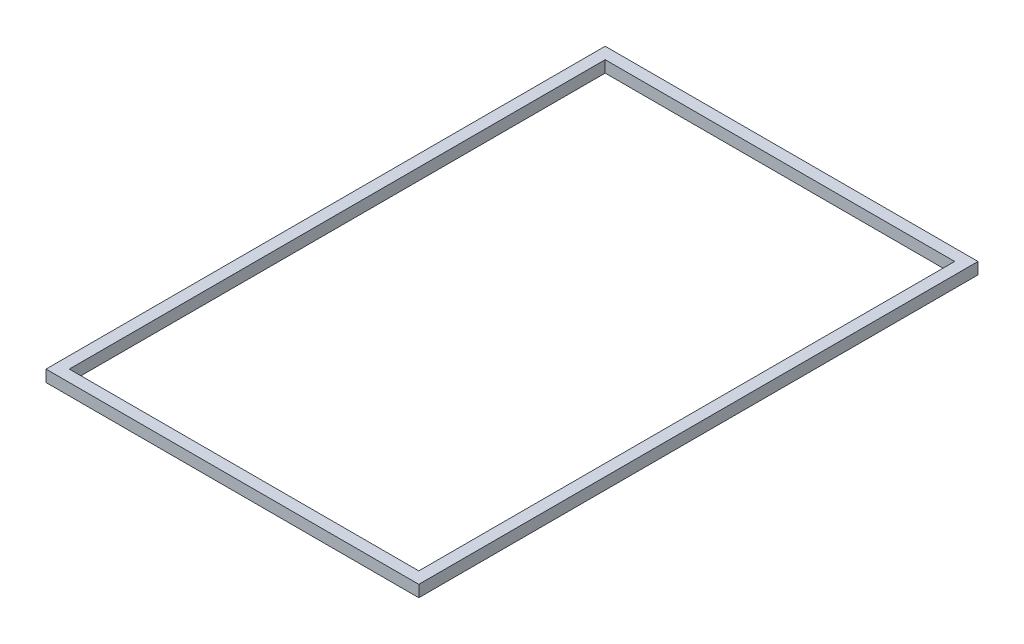
ISO-10303-21;
HEADER;
FILE_DESCRIPTION(('STEP AP214'),'2;1');
FILE_NAME('part.step','',(''),(''),'','','');
FILE_SCHEMA(('AUTOMOTIVE_DESIGN { 1 0 10303 214 1 1 1 1 }'));
ENDSEC;
DATA;
#1=APPLICATION_CONTEXT('core data for automotive mechanical design processes');
#2=APPLICATION_PROTOCOL_DEFINITION('international standard','automotive_design',2000,#1);
#3=PRODUCT_CONTEXT('',#1,'mechanical');
#4=PRODUCT('Part','Part','',(#3));
#5=PRODUCT_RELATED_PRODUCT_CATEGORY('part','',(#4));
#6=PRODUCT_DEFINITION_FORMATION('','',#4);
#7=PRODUCT_DEFINITION_CONTEXT('part definition',#1,'design');
#8=PRODUCT_DEFINITION('design','',#6,#7);
#9=PRODUCT_DEFINITION_SHAPE('','',#8);
#10=(LENGTH_UNIT() NAMED_UNIT(*) SI_UNIT(.MILLI.,.METRE.));
#11=(NAMED_UNIT(*) PLANE_ANGLE_UNIT() SI_UNIT($,.RADIAN.));
#12=(NAMED_UNIT(*) SI_UNIT($,.STERADIAN.) SOLID_ANGLE_UNIT());
#13=UNCERTAINTY_MEASURE_WITH_UNIT(LENGTH_MEASURE(1.E-05),#10,'distance_accuracy_value','');
#14=(GEOMETRIC_REPRESENTATION_CONTEXT(3) GLOBAL_UNCERTAINTY_ASSIGNED_CONTEXT((#13)) GLOBAL_UNIT_ASSIGNED_CONTEXT((#10,
#11,#12)) REPRESENTATION_CONTEXT('',''));
#15=CARTESIAN_POINT('',(0.,0.,0.));
#16=DIRECTION('',(0.,0.,1.));
#17=DIRECTION('',(1.,0.,0.));
#18=AXIS2_PLACEMENT_3D('',#15,#16,#17);
#19=CARTESIAN_POINT('',(0.,3.175,0.));
#20=DIRECTION('',(0.,-1.,0.));
#21=DIRECTION('',(0.,0.,-1.));
#22=AXIS2_PLACEMENT_3D('',#19,#20,#21);
#23=PLANE('',#22);
#24=DIRECTION('',(0.,0.,1.));
#25=VECTOR('',#24,1.);
#26=CARTESIAN_POINT('',(0.,3.175,0.));
#27=LINE('',#26,#25);
#28=CARTESIAN_POINT('',(0.,3.175,-152.4));
#29=VERTEX_POINT('',#28);
#30=CARTESIAN_POINT('',(0.,3.175,0.));
#31=VERTEX_POINT('',#30);
#32=EDGE_CURVE('E140',#29,#31,#27,.T.);
#33=ORIENTED_EDGE('',*,*,#32,.T.);
#34=DIRECTION('',(1.,0.,0.));
#35=VECTOR('',#34,1.);
#36=CARTESIAN_POINT('',(0.,3.175,0.));
#37=LINE('',#36,#35);
#38=CARTESIAN_POINT('',(101.6,3.175,0.));
#39=VERTEX_POINT('',#38);
#40=EDGE_CURVE('E143',#31,#39,#37,.T.);
#41=ORIENTED_EDGE('',*,*,#40,.T.);
#42=DIRECTION('',(0.,0.,-1.));
#43=VECTOR('',#42,1.);
#44=CARTESIAN_POINT('',(101.6,3.175,0.));
#45=LINE('',#44,#43);
#46=CARTESIAN_POINT('',(101.6,3.175,-152.4));
#47=VERTEX_POINT('',#46);
#48=EDGE_CURVE('E146',#39,#47,#45,.T.);
#49=ORIENTED_EDGE('',*,*,#48,.T.);
#50=DIRECTION('',(-1.,0.,0.));
#51=VECTOR('',#50,1.);
#52=CARTESIAN_POINT('',(0.,3.175,-152.4));
#53=LINE('',#52,#51);
#54=EDGE_CURVE('E148',#47,#29,#53,.T.);
#55=ORIENTED_EDGE('',*,*,#54,.T.);
#56=EDGE_LOOP('',(#33,#41,#49,#55));
#57=FACE_BOUND('',#56,.T.);
#58=DIRECTION('',(0.,0.,1.));
#59=VECTOR('',#58,1.);
#60=CARTESIAN_POINT('',(3.175,3.175,-3.175));
#61=LINE('',#60,#59);
#62=CARTESIAN_POINT('',(3.175,3.175,-149.225));
#63=VERTEX_POINT('',#62);
#64=CARTESIAN_POINT('',(3.175,3.175,-3.175));
#65=VERTEX_POINT('',#64);
#66=EDGE_CURVE('E104',#63,#65,#61,.T.);
#67=ORIENTED_EDGE('',*,*,#66,.F.);
#68=DIRECTION('',(-1.,0.,0.));
#69=VECTOR('',#68,1.);
#70=CARTESIAN_POINT('',(3.175,3.175,-149.225));
#71=LINE('',#70,#69);
#72=CARTESIAN_POINT('',(98.425,3.175,-149.225));
#73=VERTEX_POINT('',#72);
#74=EDGE_CURVE('E126',#73,#63,#71,.T.);
#75=ORIENTED_EDGE('',*,*,#74,.F.);
#76=DIRECTION('',(0.,0.,-1.));
#77=VECTOR('',#76,1.);
#78=CARTESIAN_POINT('',(98.425,3.175,-3.175));
#79=LINE('',#78,#77);
#80=CARTESIAN_POINT('',(98.425,3.175,-3.175));
#81=VERTEX_POINT('',#80);
#82=EDGE_CURVE('E124',#81,#73,#79,.T.);
#83=ORIENTED_EDGE('',*,*,#82,.F.);
#84=DIRECTION('',(1.,0.,0.));
#85=VECTOR('',#84,1.);
#86=CARTESIAN_POINT('',(3.175,3.175,-3.175));
#87=LINE('',#86,#85);
#88=EDGE_CURVE('E112',#65,#81,#87,.T.);
#89=ORIENTED_EDGE('',*,*,#88,.F.);
#90=EDGE_LOOP('',(#67,#75,#83,#89));
#91=FACE_BOUND('',#90,.T.);
#92=ADVANCED_FACE('F39',(#57,#91),#23,.F.);
#93=CARTESIAN_POINT('',(0.,0.,0.));
#94=DIRECTION('',(0.,-1.,0.));
#95=DIRECTION('',(0.,0.,-1.));
#96=AXIS2_PLACEMENT_3D('',#93,#94,#95);
#97=PLANE('',#96);
#98=DIRECTION('',(0.,0.,1.));
#99=VECTOR('',#98,1.);
#100=CARTESIAN_POINT('',(0.,0.,0.));
#101=LINE('',#100,#99);
#102=CARTESIAN_POINT('',(0.,0.,-152.4));
#103=VERTEX_POINT('',#102);
#104=CARTESIAN_POINT('',(0.,0.,0.));
#105=VERTEX_POINT('',#104);
#106=EDGE_CURVE('E120',#103,#105,#101,.T.);
#107=ORIENTED_EDGE('',*,*,#106,.F.);
#108=DIRECTION('',(-1.,0.,0.));
#109=VECTOR('',#108,1.);
#110=CARTESIAN_POINT('',(0.,0.,-152.4));
#111=LINE('',#110,#109);
#112=CARTESIAN_POINT('',(101.6,0.,-152.4));
#113=VERTEX_POINT('',#112);
#114=EDGE_CURVE('E144',#113,#103,#111,.T.);
#115=ORIENTED_EDGE('',*,*,#114,.F.);
#116=DIRECTION('',(0.,0.,-1.));
#117=VECTOR('',#116,1.);
#118=CARTESIAN_POINT('',(101.6,0.,0.));
#119=LINE('',#118,#117);
#120=CARTESIAN_POINT('',(101.6,0.,0.));
#121=VERTEX_POINT('',#120);
#122=EDGE_CURVE('E155',#121,#113,#119,.T.);
#123=ORIENTED_EDGE('',*,*,#122,.F.);
#124=DIRECTION('',(1.,0.,0.));
#125=VECTOR('',#124,1.);
#126=CARTESIAN_POINT('',(0.,0.,0.));
#127=LINE('',#126,#125);
#128=EDGE_CURVE('E153',#105,#121,#127,.T.);
#129=ORIENTED_EDGE('',*,*,#128,.F.);
#130=EDGE_LOOP('',(#107,#115,#123,#129));
#131=FACE_BOUND('',#130,.T.);
#132=DIRECTION('',(-1.,0.,0.));
#133=VECTOR('',#132,1.);
#134=CARTESIAN_POINT('',(3.175,0.,-149.225));
#135=LINE('',#134,#133);
#136=CARTESIAN_POINT('',(98.425,0.,-149.225));
#137=VERTEX_POINT('',#136);
#138=CARTESIAN_POINT('',(3.175,0.,-149.225));
#139=VERTEX_POINT('',#138);
#140=EDGE_CURVE('E113',#137,#139,#135,.T.);
#141=ORIENTED_EDGE('',*,*,#140,.T.);
#142=DIRECTION('',(0.,0.,1.));
#143=VECTOR('',#142,1.);
#144=CARTESIAN_POINT('',(3.175,0.,-3.175));
#145=LINE('',#144,#143);
#146=CARTESIAN_POINT('',(3.175,0.,-3.175));
#147=VERTEX_POINT('',#146);
#148=EDGE_CURVE('E62',#139,#147,#145,.T.);
#149=ORIENTED_EDGE('',*,*,#148,.T.);
#150=DIRECTION('',(1.,0.,0.));
#151=VECTOR('',#150,1.);
#152=CARTESIAN_POINT('',(3.175,0.,-3.175));
#153=LINE('',#152,#151);
#154=CARTESIAN_POINT('',(98.425,0.,-3.175));
#155=VERTEX_POINT('',#154);
#156=EDGE_CURVE('E119',#147,#155,#153,.T.);
#157=ORIENTED_EDGE('',*,*,#156,.T.);
#158=DIRECTION('',(0.,0.,-1.));
#159=VECTOR('',#158,1.);
#160=CARTESIAN_POINT('',(98.425,0.,-3.175));
#161=LINE('',#160,#159);
#162=EDGE_CURVE('E132',#155,#137,#161,.T.);
#163=ORIENTED_EDGE('',*,*,#162,.T.);
#164=EDGE_LOOP('',(#141,#149,#157,#163));
#165=FACE_BOUND('',#164,.T.);
#166=ADVANCED_FACE('F173',(#131,#165),#97,.T.);
#167=CARTESIAN_POINT('',(0.,3.175,0.));
#168=DIRECTION('',(1.,0.,0.));
#169=DIRECTION('',(0.,0.,-1.));
#170=AXIS2_PLACEMENT_3D('',#167,#168,#169);
#171=PLANE('',#170);
#172=ORIENTED_EDGE('',*,*,#106,.T.);
#173=DIRECTION('',(0.,-1.,0.));
#174=VECTOR('',#173,1.);
#175=CARTESIAN_POINT('',(0.,3.175,0.));
#176=LINE('',#175,#174);
#177=EDGE_CURVE('E11',#31,#105,#176,.T.);
#178=ORIENTED_EDGE('',*,*,#177,.F.);
#179=ORIENTED_EDGE('',*,*,#32,.F.);
#180=DIRECTION('',(0.,-1.,0.));
#181=VECTOR('',#180,1.);
#182=CARTESIAN_POINT('',(0.,3.175,-152.4));
#183=LINE('',#182,#181);
#184=EDGE_CURVE('E150',#29,#103,#183,.T.);
#185=ORIENTED_EDGE('',*,*,#184,.T.);
#186=EDGE_LOOP('',(#172,#178,#179,#185));
#187=FACE_BOUND('',#186,.T.);
#188=ADVANCED_FACE('F41',(#187),#171,.F.);
#189=CARTESIAN_POINT('',(0.,3.175,0.));
#190=DIRECTION('',(0.,0.,-1.));
#191=DIRECTION('',(-1.,0.,0.));
#192=AXIS2_PLACEMENT_3D('',#189,#190,#191);
#193=PLANE('',#192);
#194=ORIENTED_EDGE('',*,*,#128,.T.);
#195=DIRECTION('',(0.,-1.,0.));
#196=VECTOR('',#195,1.);
#197=CARTESIAN_POINT('',(101.6,3.175,0.));
#198=LINE('',#197,#196);
#199=EDGE_CURVE('E47',#39,#121,#198,.T.);
#200=ORIENTED_EDGE('',*,*,#199,.F.);
#201=ORIENTED_EDGE('',*,*,#40,.F.);
#202=ORIENTED_EDGE('',*,*,#177,.T.);
#203=EDGE_LOOP('',(#194,#200,#201,#202));
#204=FACE_BOUND('',#203,.T.);
#205=ADVANCED_FACE('F183',(#204),#193,.F.);
#206=CARTESIAN_POINT('',(101.6,3.175,0.));
#207=DIRECTION('',(-1.,0.,0.));
#208=DIRECTION('',(0.,0.,1.));
#209=AXIS2_PLACEMENT_3D('',#206,#207,#208);
#210=PLANE('',#209);
#211=ORIENTED_EDGE('',*,*,#122,.T.);
#212=DIRECTION('',(0.,-1.,0.));
#213=VECTOR('',#212,1.);
#214=CARTESIAN_POINT('',(101.6,3.175,-152.4));
#215=LINE('',#214,#213);
#216=EDGE_CURVE('E160',#47,#113,#215,.T.);
#217=ORIENTED_EDGE('',*,*,#216,.F.);
#218=ORIENTED_EDGE('',*,*,#48,.F.);
#219=ORIENTED_EDGE('',*,*,#199,.T.);
#220=EDGE_LOOP('',(#211,#217,#218,#219));
#221=FACE_BOUND('',#220,.T.);
#222=ADVANCED_FACE('F167',(#221),#210,.F.);
#223=CARTESIAN_POINT('',(0.,3.175,-152.4));
#224=DIRECTION('',(0.,0.,1.));
#225=DIRECTION('',(1.,0.,0.));
#226=AXIS2_PLACEMENT_3D('',#223,#224,#225);
#227=PLANE('',#226);
#228=ORIENTED_EDGE('',*,*,#114,.T.);
#229=ORIENTED_EDGE('',*,*,#184,.F.);
#230=ORIENTED_EDGE('',*,*,#54,.F.);
#231=ORIENTED_EDGE('',*,*,#216,.T.);
#232=EDGE_LOOP('',(#228,#229,#230,#231));
#233=FACE_BOUND('',#232,.T.);
#234=ADVANCED_FACE('F177',(#233),#227,.F.);
#235=CARTESIAN_POINT('',(3.175,3.175,-3.175));
#236=DIRECTION('',(1.,0.,0.));
#237=DIRECTION('',(0.,0.,-1.));
#238=AXIS2_PLACEMENT_3D('',#235,#236,#237);
#239=PLANE('',#238);
#240=ORIENTED_EDGE('',*,*,#148,.F.);
#241=DIRECTION('',(0.,-1.,0.));
#242=VECTOR('',#241,1.);
#243=CARTESIAN_POINT('',(3.175,3.175,-149.225));
#244=LINE('',#243,#242);
#245=EDGE_CURVE('E108',#63,#139,#244,.T.);
#246=ORIENTED_EDGE('',*,*,#245,.F.);
#247=ORIENTED_EDGE('',*,*,#66,.T.);
#248=DIRECTION('',(0.,-1.,0.));
#249=VECTOR('',#248,1.);
#250=CARTESIAN_POINT('',(3.175,3.175,-3.175));
#251=LINE('',#250,#249);
#252=EDGE_CURVE('E107',#65,#147,#251,.T.);
#253=ORIENTED_EDGE('',*,*,#252,.T.);
#254=EDGE_LOOP('',(#240,#246,#247,#253));
#255=FACE_BOUND('',#254,.T.);
#256=ADVANCED_FACE('F106',(#255),#239,.T.);
#257=CARTESIAN_POINT('',(3.175,3.175,-3.175));
#258=DIRECTION('',(0.,0.,-1.));
#259=DIRECTION('',(-1.,0.,0.));
#260=AXIS2_PLACEMENT_3D('',#257,#258,#259);
#261=PLANE('',#260);
#262=ORIENTED_EDGE('',*,*,#156,.F.);
#263=ORIENTED_EDGE('',*,*,#252,.F.);
#264=ORIENTED_EDGE('',*,*,#88,.T.);
#265=DIRECTION('',(0.,-1.,0.));
#266=VECTOR('',#265,1.);
#267=CARTESIAN_POINT('',(98.425,3.175,-3.175));
#268=LINE('',#267,#266);
#269=EDGE_CURVE('E121',#81,#155,#268,.T.);
#270=ORIENTED_EDGE('',*,*,#269,.T.);
#271=EDGE_LOOP('',(#262,#263,#264,#270));
#272=FACE_BOUND('',#271,.T.);
#273=ADVANCED_FACE('F116',(#272),#261,.T.);
#274=CARTESIAN_POINT('',(98.425,3.175,-3.175));
#275=DIRECTION('',(-1.,0.,0.));
#276=DIRECTION('',(0.,0.,1.));
#277=AXIS2_PLACEMENT_3D('',#274,#275,#276);
#278=PLANE('',#277);
#279=ORIENTED_EDGE('',*,*,#162,.F.);
#280=ORIENTED_EDGE('',*,*,#269,.F.);
#281=ORIENTED_EDGE('',*,*,#82,.T.);
#282=DIRECTION('',(0.,-1.,0.));
#283=VECTOR('',#282,1.);
#284=CARTESIAN_POINT('',(98.425,3.175,-149.225));
#285=LINE('',#284,#283);
#286=EDGE_CURVE('E54',#73,#137,#285,.T.);
#287=ORIENTED_EDGE('',*,*,#286,.T.);
#288=EDGE_LOOP('',(#279,#280,#281,#287));
#289=FACE_BOUND('',#288,.T.);
#290=ADVANCED_FACE('F206',(#289),#278,.T.);
#291=CARTESIAN_POINT('',(3.175,3.175,-149.225));
#292=DIRECTION('',(0.,0.,1.));
#293=DIRECTION('',(1.,0.,0.));
#294=AXIS2_PLACEMENT_3D('',#291,#292,#293);
#295=PLANE('',#294);
#296=ORIENTED_EDGE('',*,*,#140,.F.);
#297=ORIENTED_EDGE('',*,*,#286,.F.);
#298=ORIENTED_EDGE('',*,*,#74,.T.);
#299=ORIENTED_EDGE('',*,*,#245,.T.);
#300=EDGE_LOOP('',(#296,#297,#298,#299));
#301=FACE_BOUND('',#300,.T.);
#302=ADVANCED_FACE('F210',(#301),#295,.T.);
#303=CLOSED_SHELL('',(#92,#166,#188,#205,#222,#234,#256,#273,#290,#302));
#304=MANIFOLD_SOLID_BREP('B2',#303);
#305=ADVANCED_BREP_SHAPE_REPRESENTATION('',(#18,#304),#14);
#306=SHAPE_DEFINITION_REPRESENTATION(#9,#305);
ENDSEC;
END-ISO-10303-21;
